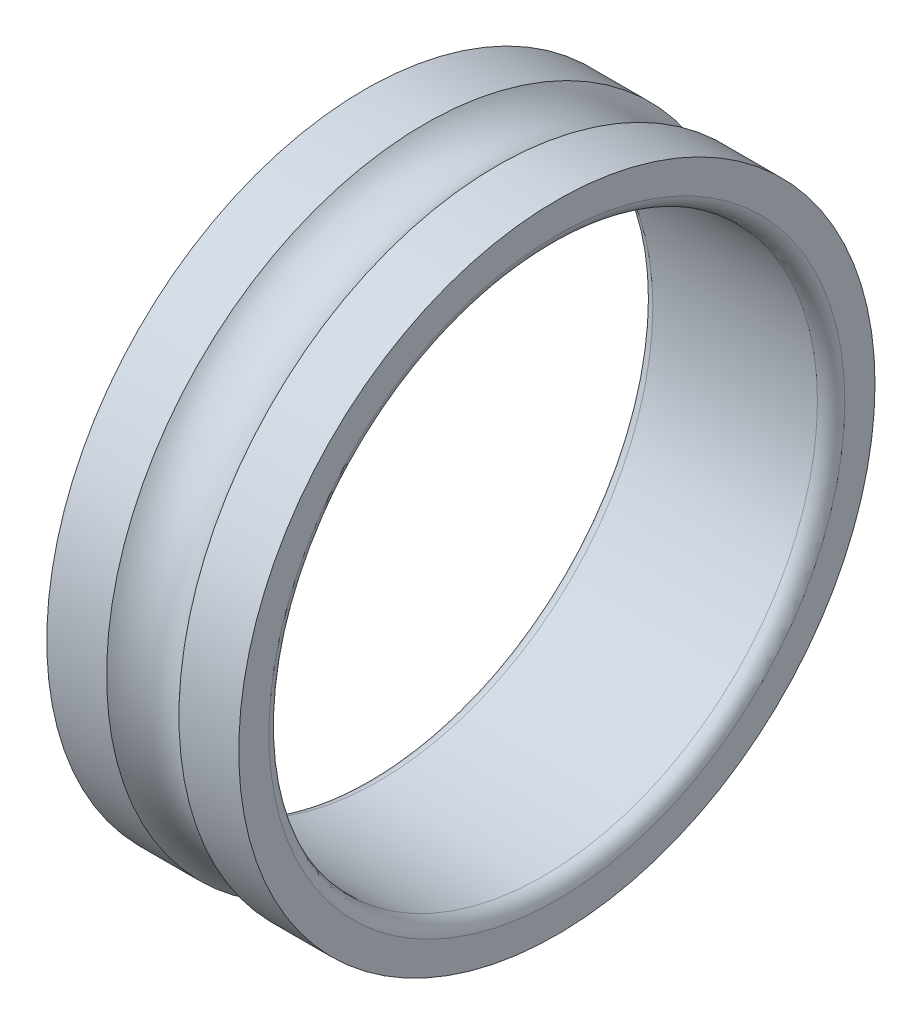
ISO-10303-21;
HEADER;
FILE_DESCRIPTION(('STEP AP214'),'2;1');
FILE_NAME('part.step','',(''),(''),'','','');
FILE_SCHEMA(('AUTOMOTIVE_DESIGN { 1 0 10303 214 1 1 1 1 }'));
ENDSEC;
DATA;
#1=APPLICATION_CONTEXT('core data for automotive mechanical design processes');
#2=APPLICATION_PROTOCOL_DEFINITION('international standard','automotive_design',2000,#1);
#3=PRODUCT_CONTEXT('',#1,'mechanical');
#4=PRODUCT('Part','Part','',(#3));
#5=PRODUCT_RELATED_PRODUCT_CATEGORY('part','',(#4));
#6=PRODUCT_DEFINITION_FORMATION('','',#4);
#7=PRODUCT_DEFINITION_CONTEXT('part definition',#1,'design');
#8=PRODUCT_DEFINITION('design','',#6,#7);
#9=PRODUCT_DEFINITION_SHAPE('','',#8);
#10=(LENGTH_UNIT() NAMED_UNIT(*) SI_UNIT(.MILLI.,.METRE.));
#11=(NAMED_UNIT(*) PLANE_ANGLE_UNIT() SI_UNIT($,.RADIAN.));
#12=(NAMED_UNIT(*) SI_UNIT($,.STERADIAN.) SOLID_ANGLE_UNIT());
#13=UNCERTAINTY_MEASURE_WITH_UNIT(LENGTH_MEASURE(1.E-05),#10,'distance_accuracy_value','');
#14=(GEOMETRIC_REPRESENTATION_CONTEXT(3) GLOBAL_UNCERTAINTY_ASSIGNED_CONTEXT((#13)) GLOBAL_UNIT_ASSIGNED_CONTEXT((#10,
#11,#12)) REPRESENTATION_CONTEXT('',''));
#15=CARTESIAN_POINT('',(0.,0.,0.));
#16=DIRECTION('',(0.,0.,1.));
#17=DIRECTION('',(1.,0.,0.));
#18=AXIS2_PLACEMENT_3D('',#15,#16,#17);
#19=CARTESIAN_POINT('',(7.,0.,0.));
#20=DIRECTION('',(1.,0.,0.));
#21=DIRECTION('',(0.,0.,-1.));
#22=AXIS2_PLACEMENT_3D('',#19,#20,#21);
#23=CYLINDRICAL_SURFACE('',#22,11.6);
#24=CARTESIAN_POINT('',(2.18090940417271,0.,0.));
#25=DIRECTION('',(1.,0.,0.));
#26=DIRECTION('',(0.,0.,-1.));
#27=AXIS2_PLACEMENT_3D('',#24,#25,#26);
#28=CIRCLE('',#27,11.6);
#29=CARTESIAN_POINT('',(2.18090940417271,0.,-11.6));
#30=VERTEX_POINT('',#29);
#31=EDGE_CURVE('E10',#30,#30,#28,.T.);
#32=ORIENTED_EDGE('',*,*,#31,.F.);
#33=EDGE_LOOP('',(#32));
#34=FACE_BOUND('',#33,.T.);
#35=CARTESIAN_POINT('',(0.,0.,0.));
#36=DIRECTION('',(1.,0.,0.));
#37=DIRECTION('',(0.,0.,-1.));
#38=AXIS2_PLACEMENT_3D('',#35,#36,#37);
#39=CIRCLE('',#38,11.6);
#40=CARTESIAN_POINT('',(0.,0.,-11.6));
#41=VERTEX_POINT('',#40);
#42=EDGE_CURVE('E44',#41,#41,#39,.T.);
#43=ORIENTED_EDGE('',*,*,#42,.T.);
#44=EDGE_LOOP('',(#43));
#45=FACE_BOUND('',#44,.T.);
#46=ADVANCED_FACE('F15',(#34,#45),#23,.T.);
#47=CARTESIAN_POINT('',(3.5,0.,0.));
#48=DIRECTION('',(1.,0.,0.));
#49=DIRECTION('',(0.,0.,-1.));
#50=AXIS2_PLACEMENT_3D('',#47,#48,#49);
#51=TOROIDAL_SURFACE('',#50,12.75,1.75);
#52=ORIENTED_EDGE('',*,*,#31,.T.);
#53=EDGE_LOOP('',(#52));
#54=FACE_BOUND('',#53,.T.);
#55=CARTESIAN_POINT('',(4.81909059582729,0.,0.));
#56=DIRECTION('',(1.,0.,0.));
#57=DIRECTION('',(0.,0.,-1.));
#58=AXIS2_PLACEMENT_3D('',#55,#56,#57);
#59=CIRCLE('',#58,11.6);
#60=CARTESIAN_POINT('',(4.81909059582729,0.,-11.6));
#61=VERTEX_POINT('',#60);
#62=EDGE_CURVE('E22',#61,#61,#59,.T.);
#63=ORIENTED_EDGE('',*,*,#62,.F.);
#64=EDGE_LOOP('',(#63));
#65=FACE_BOUND('',#64,.T.);
#66=ADVANCED_FACE('F76',(#54,#65),#51,.F.);
#67=CARTESIAN_POINT('',(7.,0.,0.));
#68=DIRECTION('',(1.,0.,0.));
#69=DIRECTION('',(0.,0.,-1.));
#70=AXIS2_PLACEMENT_3D('',#67,#68,#69);
#71=CYLINDRICAL_SURFACE('',#70,11.6);
#72=CARTESIAN_POINT('',(7.,0.,0.));
#73=DIRECTION('',(1.,0.,0.));
#74=DIRECTION('',(0.,0.,-1.));
#75=AXIS2_PLACEMENT_3D('',#72,#73,#74);
#76=CIRCLE('',#75,11.6);
#77=CARTESIAN_POINT('',(7.,0.,-11.6));
#78=VERTEX_POINT('',#77);
#79=EDGE_CURVE('E30',#78,#78,#76,.T.);
#80=ORIENTED_EDGE('',*,*,#79,.F.);
#81=EDGE_LOOP('',(#80));
#82=FACE_BOUND('',#81,.T.);
#83=ORIENTED_EDGE('',*,*,#62,.T.);
#84=EDGE_LOOP('',(#83));
#85=FACE_BOUND('',#84,.T.);
#86=ADVANCED_FACE('F71',(#82,#85),#71,.T.);
#87=CARTESIAN_POINT('',(7.,10.5,0.));
#88=DIRECTION('',(1.,0.,0.));
#89=DIRECTION('',(0.,1.,0.));
#90=AXIS2_PLACEMENT_3D('',#87,#88,#89);
#91=PLANE('',#90);
#92=CARTESIAN_POINT('',(7.,0.,0.));
#93=DIRECTION('',(1.,0.,0.));
#94=DIRECTION('',(0.,0.,-1.));
#95=AXIS2_PLACEMENT_3D('',#92,#93,#94);
#96=CIRCLE('',#95,10.5);
#97=CARTESIAN_POINT('',(7.,0.,-10.5));
#98=VERTEX_POINT('',#97);
#99=EDGE_CURVE('E37',#98,#98,#96,.T.);
#100=ORIENTED_EDGE('',*,*,#99,.F.);
#101=EDGE_LOOP('',(#100));
#102=FACE_BOUND('',#101,.T.);
#103=ORIENTED_EDGE('',*,*,#79,.T.);
#104=EDGE_LOOP('',(#103));
#105=FACE_BOUND('',#104,.T.);
#106=ADVANCED_FACE('F65',(#102,#105),#91,.T.);
#107=CARTESIAN_POINT('',(6.40721726997995,0.,0.));
#108=DIRECTION('',(1.,0.,0.));
#109=DIRECTION('',(0.,0.,-1.));
#110=AXIS2_PLACEMENT_3D('',#107,#108,#109);
#111=TOROIDAL_SURFACE('',#110,10.5927827300201,0.6);
#112=CARTESIAN_POINT('',(6.5,0.,0.));
#113=DIRECTION('',(1.,0.,0.));
#114=DIRECTION('',(0.,0.,-1.));
#115=AXIS2_PLACEMENT_3D('',#112,#113,#114);
#116=CIRCLE('',#115,10.);
#117=CARTESIAN_POINT('',(6.5,0.,-10.));
#118=VERTEX_POINT('',#117);
#119=EDGE_CURVE('E43',#118,#118,#116,.T.);
#120=ORIENTED_EDGE('',*,*,#119,.F.);
#121=EDGE_LOOP('',(#120));
#122=FACE_BOUND('',#121,.T.);
#123=ORIENTED_EDGE('',*,*,#99,.T.);
#124=EDGE_LOOP('',(#123));
#125=FACE_BOUND('',#124,.T.);
#126=ADVANCED_FACE('F62',(#122,#125),#111,.T.);
#127=CARTESIAN_POINT('',(7.,0.,0.));
#128=DIRECTION('',(1.,0.,0.));
#129=DIRECTION('',(0.,0.,-1.));
#130=AXIS2_PLACEMENT_3D('',#127,#128,#129);
#131=CYLINDRICAL_SURFACE('',#130,10.);
#132=CARTESIAN_POINT('',(0.5,0.,0.));
#133=DIRECTION('',(1.,0.,0.));
#134=DIRECTION('',(0.,0.,-1.));
#135=AXIS2_PLACEMENT_3D('',#132,#133,#134);
#136=CIRCLE('',#135,10.);
#137=CARTESIAN_POINT('',(0.5,0.,-10.));
#138=VERTEX_POINT('',#137);
#139=EDGE_CURVE('E40',#138,#138,#136,.T.);
#140=ORIENTED_EDGE('',*,*,#139,.F.);
#141=EDGE_LOOP('',(#140));
#142=FACE_BOUND('',#141,.T.);
#143=ORIENTED_EDGE('',*,*,#119,.T.);
#144=EDGE_LOOP('',(#143));
#145=FACE_BOUND('',#144,.T.);
#146=ADVANCED_FACE('F60',(#142,#145),#131,.F.);
#147=CARTESIAN_POINT('',(0.592782730020051,0.,0.));
#148=DIRECTION('',(1.,0.,0.));
#149=DIRECTION('',(0.,0.,-1.));
#150=AXIS2_PLACEMENT_3D('',#147,#148,#149);
#151=TOROIDAL_SURFACE('',#150,10.5927827300201,0.6);
#152=CARTESIAN_POINT('',(0.,0.,0.));
#153=DIRECTION('',(1.,0.,0.));
#154=DIRECTION('',(0.,0.,-1.));
#155=AXIS2_PLACEMENT_3D('',#152,#153,#154);
#156=CIRCLE('',#155,10.5);
#157=CARTESIAN_POINT('',(0.,0.,-10.5));
#158=VERTEX_POINT('',#157);
#159=EDGE_CURVE('E48',#158,#158,#156,.T.);
#160=ORIENTED_EDGE('',*,*,#159,.F.);
#161=EDGE_LOOP('',(#160));
#162=FACE_BOUND('',#161,.T.);
#163=ORIENTED_EDGE('',*,*,#139,.T.);
#164=EDGE_LOOP('',(#163));
#165=FACE_BOUND('',#164,.T.);
#166=ADVANCED_FACE('F92',(#162,#165),#151,.T.);
#167=CARTESIAN_POINT('',(0.,11.6,0.));
#168=DIRECTION('',(-1.,0.,0.));
#169=DIRECTION('',(0.,0.,1.));
#170=AXIS2_PLACEMENT_3D('',#167,#168,#169);
#171=PLANE('',#170);
#172=ORIENTED_EDGE('',*,*,#42,.F.);
#173=EDGE_LOOP('',(#172));
#174=FACE_BOUND('',#173,.T.);
#175=ORIENTED_EDGE('',*,*,#159,.T.);
#176=EDGE_LOOP('',(#175));
#177=FACE_BOUND('',#176,.T.);
#178=ADVANCED_FACE('F89',(#174,#177),#171,.T.);
#179=CLOSED_SHELL('',(#46,#66,#86,#106,#126,#146,#166,#178));
#180=MANIFOLD_SOLID_BREP('B1',#179);
#181=ADVANCED_BREP_SHAPE_REPRESENTATION('',(#18,#180),#14);
#182=SHAPE_DEFINITION_REPRESENTATION(#9,#181);
ENDSEC;
END-ISO-10303-21;
